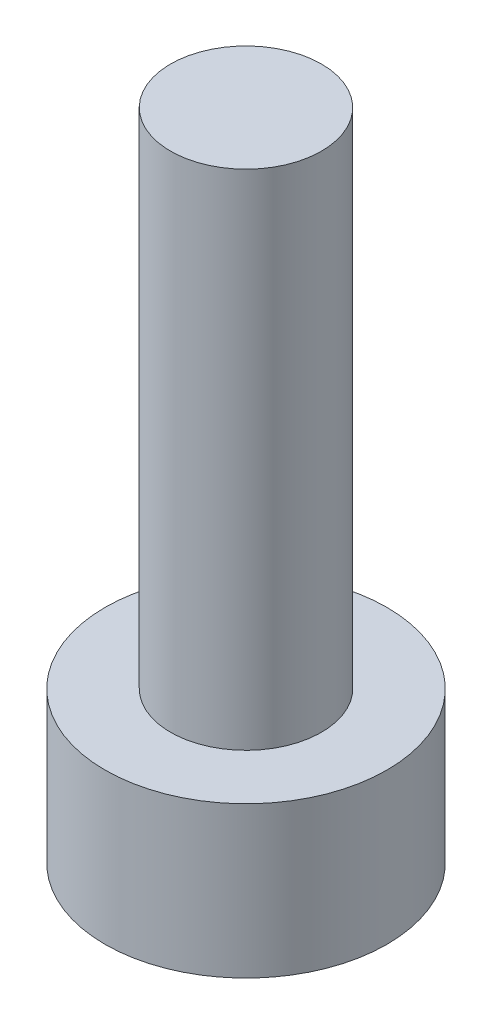
ISO-10303-21;
HEADER;
FILE_DESCRIPTION(('STEP AP214'),'2;1');
FILE_NAME('part.step','',(''),(''),'','','');
FILE_SCHEMA(('AUTOMOTIVE_DESIGN { 1 0 10303 214 1 1 1 1 }'));
ENDSEC;
DATA;
#1=APPLICATION_CONTEXT('core data for automotive mechanical design processes');
#2=APPLICATION_PROTOCOL_DEFINITION('international standard','automotive_design',2000,#1);
#3=PRODUCT_CONTEXT('',#1,'mechanical');
#4=PRODUCT('Part','Part','',(#3));
#5=PRODUCT_RELATED_PRODUCT_CATEGORY('part','',(#4));
#6=PRODUCT_DEFINITION_FORMATION('','',#4);
#7=PRODUCT_DEFINITION_CONTEXT('part definition',#1,'design');
#8=PRODUCT_DEFINITION('design','',#6,#7);
#9=PRODUCT_DEFINITION_SHAPE('','',#8);
#10=(LENGTH_UNIT() NAMED_UNIT(*) SI_UNIT(.MILLI.,.METRE.));
#11=(NAMED_UNIT(*) PLANE_ANGLE_UNIT() SI_UNIT($,.RADIAN.));
#12=(NAMED_UNIT(*) SI_UNIT($,.STERADIAN.) SOLID_ANGLE_UNIT());
#13=UNCERTAINTY_MEASURE_WITH_UNIT(LENGTH_MEASURE(1.E-05),#10,'distance_accuracy_value','');
#14=(GEOMETRIC_REPRESENTATION_CONTEXT(3) GLOBAL_UNCERTAINTY_ASSIGNED_CONTEXT((#13)) GLOBAL_UNIT_ASSIGNED_CONTEXT((#10,
#11,#12)) REPRESENTATION_CONTEXT('',''));
#15=CARTESIAN_POINT('',(0.,0.,0.));
#16=DIRECTION('',(0.,0.,1.));
#17=DIRECTION('',(1.,0.,0.));
#18=AXIS2_PLACEMENT_3D('',#15,#16,#17);
#19=CARTESIAN_POINT('',(0.,0.5,0.));
#20=DIRECTION('',(0.,-1.,0.));
#21=DIRECTION('',(0.,0.,-1.));
#22=AXIS2_PLACEMENT_3D('',#19,#20,#21);
#23=PLANE('',#22);
#24=DIRECTION('',(-0.5,0.,0.866025403784439));
#25=VECTOR('',#24,1.);
#26=CARTESIAN_POINT('',(-1.44337567297406,0.5,0.));
#27=LINE('',#26,#25);
#28=CARTESIAN_POINT('',(-1.44337567297406,0.5,0.));
#29=VERTEX_POINT('',#28);
#30=CARTESIAN_POINT('',(-0.721687836487032,0.5,-1.25));
#31=VERTEX_POINT('',#30);
#32=EDGE_CURVE('E90',#29,#31,#27,.F.);
#33=ORIENTED_EDGE('',*,*,#32,.T.);
#34=DIRECTION('',(-1.,0.,0.));
#35=VECTOR('',#34,1.);
#36=CARTESIAN_POINT('',(-0.721687836487032,0.5,-1.25));
#37=LINE('',#36,#35);
#38=CARTESIAN_POINT('',(0.721687836487032,0.5,-1.25));
#39=VERTEX_POINT('',#38);
#40=EDGE_CURVE('E126',#31,#39,#37,.F.);
#41=ORIENTED_EDGE('',*,*,#40,.T.);
#42=DIRECTION('',(-0.5,0.,-0.866025403784439));
#43=VECTOR('',#42,1.);
#44=CARTESIAN_POINT('',(0.721687836487032,0.5,-1.25));
#45=LINE('',#44,#43);
#46=CARTESIAN_POINT('',(1.44337567297406,0.5,0.));
#47=VERTEX_POINT('',#46);
#48=EDGE_CURVE('E121',#39,#47,#45,.F.);
#49=ORIENTED_EDGE('',*,*,#48,.T.);
#50=DIRECTION('',(0.5,0.,-0.866025403784438));
#51=VECTOR('',#50,1.);
#52=CARTESIAN_POINT('',(1.44337567297406,0.5,0.));
#53=LINE('',#52,#51);
#54=CARTESIAN_POINT('',(0.721687836487032,0.5,1.25));
#55=VERTEX_POINT('',#54);
#56=EDGE_CURVE('E73',#47,#55,#53,.F.);
#57=ORIENTED_EDGE('',*,*,#56,.T.);
#58=DIRECTION('',(1.,0.,0.));
#59=VECTOR('',#58,1.);
#60=CARTESIAN_POINT('',(0.721687836487032,0.5,1.25));
#61=LINE('',#60,#59);
#62=CARTESIAN_POINT('',(-0.721687836487032,0.5,1.25));
#63=VERTEX_POINT('',#62);
#64=EDGE_CURVE('E70',#55,#63,#61,.F.);
#65=ORIENTED_EDGE('',*,*,#64,.T.);
#66=DIRECTION('',(0.5,0.,0.866025403784439));
#67=VECTOR('',#66,1.);
#68=CARTESIAN_POINT('',(-0.721687836487032,0.5,1.25));
#69=LINE('',#68,#67);
#70=EDGE_CURVE('E67',#63,#29,#69,.F.);
#71=ORIENTED_EDGE('',*,*,#70,.T.);
#72=EDGE_LOOP('',(#33,#41,#49,#57,#65,#71));
#73=FACE_BOUND('',#72,.T.);
#74=ADVANCED_FACE('F16',(#73),#23,.T.);
#75=CARTESIAN_POINT('',(0.721687836487032,0.5,1.25));
#76=DIRECTION('',(0.,0.,1.));
#77=DIRECTION('',(1.,0.,0.));
#78=AXIS2_PLACEMENT_3D('',#75,#76,#77);
#79=PLANE('',#78);
#80=DIRECTION('',(0.,1.,0.));
#81=VECTOR('',#80,1.);
#82=CARTESIAN_POINT('',(-0.721687836487032,0.5,1.25));
#83=LINE('',#82,#81);
#84=CARTESIAN_POINT('',(-0.721687836487032,0.,1.25));
#85=VERTEX_POINT('',#84);
#86=EDGE_CURVE('E76',#85,#63,#83,.T.);
#87=ORIENTED_EDGE('',*,*,#86,.T.);
#88=ORIENTED_EDGE('',*,*,#64,.F.);
#89=DIRECTION('',(0.,1.,0.));
#90=VECTOR('',#89,1.);
#91=CARTESIAN_POINT('',(0.721687836487032,0.5,1.25));
#92=LINE('',#91,#90);
#93=CARTESIAN_POINT('',(0.721687836487032,0.,1.25));
#94=VERTEX_POINT('',#93);
#95=EDGE_CURVE('E116',#55,#94,#92,.F.);
#96=ORIENTED_EDGE('',*,*,#95,.T.);
#97=DIRECTION('',(1.,0.,0.));
#98=VECTOR('',#97,1.);
#99=CARTESIAN_POINT('',(0.,0.,1.25));
#100=LINE('',#99,#98);
#101=EDGE_CURVE('E81',#94,#85,#100,.F.);
#102=ORIENTED_EDGE('',*,*,#101,.T.);
#103=EDGE_LOOP('',(#87,#88,#96,#102));
#104=FACE_BOUND('',#103,.T.);
#105=ADVANCED_FACE('F79',(#104),#79,.F.);
#106=CARTESIAN_POINT('',(-0.721687836487032,0.5,1.25));
#107=DIRECTION('',(-0.866025403784439,0.,0.5));
#108=DIRECTION('',(0.5,0.,0.866025403784439));
#109=AXIS2_PLACEMENT_3D('',#106,#107,#108);
#110=PLANE('',#109);
#111=DIRECTION('',(0.,1.,0.));
#112=VECTOR('',#111,1.);
#113=CARTESIAN_POINT('',(-1.44337567297406,0.5,0.));
#114=LINE('',#113,#112);
#115=CARTESIAN_POINT('',(-1.44337567297406,0.,0.));
#116=VERTEX_POINT('',#115);
#117=EDGE_CURVE('E87',#116,#29,#114,.T.);
#118=ORIENTED_EDGE('',*,*,#117,.T.);
#119=ORIENTED_EDGE('',*,*,#70,.F.);
#120=ORIENTED_EDGE('',*,*,#86,.F.);
#121=DIRECTION('',(-0.5,0.,-0.866025403784439));
#122=VECTOR('',#121,1.);
#123=CARTESIAN_POINT('',(-0.721687836487032,0.,1.25));
#124=LINE('',#123,#122);
#125=EDGE_CURVE('E113',#85,#116,#124,.T.);
#126=ORIENTED_EDGE('',*,*,#125,.T.);
#127=EDGE_LOOP('',(#118,#119,#120,#126));
#128=FACE_BOUND('',#127,.T.);
#129=ADVANCED_FACE('F85',(#128),#110,.F.);
#130=CARTESIAN_POINT('',(-1.44337567297406,0.5,0.));
#131=DIRECTION('',(-0.866025403784439,0.,-0.5));
#132=DIRECTION('',(-0.5,0.,0.866025403784439));
#133=AXIS2_PLACEMENT_3D('',#130,#131,#132);
#134=PLANE('',#133);
#135=DIRECTION('',(0.,1.,0.));
#136=VECTOR('',#135,1.);
#137=CARTESIAN_POINT('',(-0.721687836487032,0.5,-1.25));
#138=LINE('',#137,#136);
#139=CARTESIAN_POINT('',(-0.721687836487031,0.,-1.25));
#140=VERTEX_POINT('',#139);
#141=EDGE_CURVE('E128',#140,#31,#138,.T.);
#142=ORIENTED_EDGE('',*,*,#141,.T.);
#143=ORIENTED_EDGE('',*,*,#32,.F.);
#144=ORIENTED_EDGE('',*,*,#117,.F.);
#145=DIRECTION('',(0.5,0.,-0.866025403784438));
#146=VECTOR('',#145,1.);
#147=CARTESIAN_POINT('',(-1.44337567297406,0.,0.));
#148=LINE('',#147,#146);
#149=EDGE_CURVE('E111',#116,#140,#148,.T.);
#150=ORIENTED_EDGE('',*,*,#149,.T.);
#151=EDGE_LOOP('',(#142,#143,#144,#150));
#152=FACE_BOUND('',#151,.T.);
#153=ADVANCED_FACE('F133',(#152),#134,.F.);
#154=CARTESIAN_POINT('',(-0.721687836487032,0.5,-1.25));
#155=DIRECTION('',(0.,0.,-1.));
#156=DIRECTION('',(-1.,0.,0.));
#157=AXIS2_PLACEMENT_3D('',#154,#155,#156);
#158=PLANE('',#157);
#159=DIRECTION('',(0.,1.,0.));
#160=VECTOR('',#159,1.);
#161=CARTESIAN_POINT('',(0.721687836487032,0.5,-1.25));
#162=LINE('',#161,#160);
#163=CARTESIAN_POINT('',(0.721687836487032,0.,-1.25));
#164=VERTEX_POINT('',#163);
#165=EDGE_CURVE('E123',#164,#39,#162,.T.);
#166=ORIENTED_EDGE('',*,*,#165,.T.);
#167=ORIENTED_EDGE('',*,*,#40,.F.);
#168=ORIENTED_EDGE('',*,*,#141,.F.);
#169=DIRECTION('',(1.,0.,0.));
#170=VECTOR('',#169,1.);
#171=CARTESIAN_POINT('',(0.,0.,-1.25));
#172=LINE('',#171,#170);
#173=EDGE_CURVE('E107',#140,#164,#172,.T.);
#174=ORIENTED_EDGE('',*,*,#173,.T.);
#175=EDGE_LOOP('',(#166,#167,#168,#174));
#176=FACE_BOUND('',#175,.T.);
#177=ADVANCED_FACE('F137',(#176),#158,.F.);
#178=CARTESIAN_POINT('',(0.721687836487032,0.5,-1.25));
#179=DIRECTION('',(0.866025403784439,0.,-0.5));
#180=DIRECTION('',(-0.5,0.,-0.866025403784439));
#181=AXIS2_PLACEMENT_3D('',#178,#179,#180);
#182=PLANE('',#181);
#183=DIRECTION('',(0.,1.,0.));
#184=VECTOR('',#183,1.);
#185=CARTESIAN_POINT('',(1.44337567297406,0.5,0.));
#186=LINE('',#185,#184);
#187=CARTESIAN_POINT('',(1.44337567297406,0.,0.));
#188=VERTEX_POINT('',#187);
#189=EDGE_CURVE('E119',#188,#47,#186,.T.);
#190=ORIENTED_EDGE('',*,*,#189,.T.);
#191=ORIENTED_EDGE('',*,*,#48,.F.);
#192=ORIENTED_EDGE('',*,*,#165,.F.);
#193=DIRECTION('',(0.5,0.,0.866025403784438));
#194=VECTOR('',#193,1.);
#195=CARTESIAN_POINT('',(0.721687836487032,0.,-1.25));
#196=LINE('',#195,#194);
#197=EDGE_CURVE('E34',#164,#188,#196,.T.);
#198=ORIENTED_EDGE('',*,*,#197,.T.);
#199=EDGE_LOOP('',(#190,#191,#192,#198));
#200=FACE_BOUND('',#199,.T.);
#201=ADVANCED_FACE('F139',(#200),#182,.F.);
#202=CARTESIAN_POINT('',(1.44337567297406,0.5,0.));
#203=DIRECTION('',(0.866025403784438,0.,0.5));
#204=DIRECTION('',(0.5,0.,-0.866025403784438));
#205=AXIS2_PLACEMENT_3D('',#202,#203,#204);
#206=PLANE('',#205);
#207=ORIENTED_EDGE('',*,*,#95,.F.);
#208=ORIENTED_EDGE('',*,*,#56,.F.);
#209=ORIENTED_EDGE('',*,*,#189,.F.);
#210=DIRECTION('',(-0.500000000000001,0.,0.866025403784438));
#211=VECTOR('',#210,1.);
#212=CARTESIAN_POINT('',(1.44337567297406,0.,0.));
#213=LINE('',#212,#211);
#214=EDGE_CURVE('E100',#188,#94,#213,.T.);
#215=ORIENTED_EDGE('',*,*,#214,.T.);
#216=EDGE_LOOP('',(#207,#208,#209,#215));
#217=FACE_BOUND('',#216,.T.);
#218=ADVANCED_FACE('F140',(#217),#206,.F.);
#219=CARTESIAN_POINT('',(0.,0.,0.));
#220=DIRECTION('',(0.,1.,0.));
#221=DIRECTION('',(0.,0.,1.));
#222=AXIS2_PLACEMENT_3D('',#219,#220,#221);
#223=PLANE('',#222);
#224=CARTESIAN_POINT('',(0.,0.,0.));
#225=DIRECTION('',(0.,-1.,0.));
#226=DIRECTION('',(0.,0.,-1.));
#227=AXIS2_PLACEMENT_3D('',#224,#225,#226);
#228=CIRCLE('',#227,2.8);
#229=CARTESIAN_POINT('',(0.,0.,-2.8));
#230=VERTEX_POINT('',#229);
#231=EDGE_CURVE('E19',#230,#230,#228,.F.);
#232=ORIENTED_EDGE('',*,*,#231,.F.);
#233=EDGE_LOOP('',(#232));
#234=FACE_BOUND('',#233,.T.);
#235=ORIENTED_EDGE('',*,*,#197,.F.);
#236=ORIENTED_EDGE('',*,*,#173,.F.);
#237=ORIENTED_EDGE('',*,*,#149,.F.);
#238=ORIENTED_EDGE('',*,*,#125,.F.);
#239=ORIENTED_EDGE('',*,*,#101,.F.);
#240=ORIENTED_EDGE('',*,*,#214,.F.);
#241=EDGE_LOOP('',(#235,#236,#237,#238,#239,#240));
#242=FACE_BOUND('',#241,.T.);
#243=ADVANCED_FACE('F142',(#234,#242),#223,.F.);
#244=CARTESIAN_POINT('',(0.,3.,0.));
#245=DIRECTION('',(0.,-1.,0.));
#246=DIRECTION('',(0.,0.,-1.));
#247=AXIS2_PLACEMENT_3D('',#244,#245,#246);
#248=CYLINDRICAL_SURFACE('',#247,2.8);
#249=ORIENTED_EDGE('',*,*,#231,.T.);
#250=EDGE_LOOP('',(#249));
#251=FACE_BOUND('',#250,.T.);
#252=CARTESIAN_POINT('',(0.,3.,0.));
#253=DIRECTION('',(0.,-1.,0.));
#254=DIRECTION('',(0.,0.,-1.));
#255=AXIS2_PLACEMENT_3D('',#252,#253,#254);
#256=CIRCLE('',#255,2.8);
#257=CARTESIAN_POINT('',(0.,3.,-2.8));
#258=VERTEX_POINT('',#257);
#259=EDGE_CURVE('E95',#258,#258,#256,.F.);
#260=ORIENTED_EDGE('',*,*,#259,.F.);
#261=EDGE_LOOP('',(#260));
#262=FACE_BOUND('',#261,.T.);
#263=ADVANCED_FACE('F149',(#251,#262),#248,.T.);
#264=CARTESIAN_POINT('',(0.,13.,0.));
#265=DIRECTION('',(0.,1.,0.));
#266=DIRECTION('',(0.,0.,1.));
#267=AXIS2_PLACEMENT_3D('',#264,#265,#266);
#268=PLANE('',#267);
#269=CARTESIAN_POINT('',(0.,13.,0.));
#270=DIRECTION('',(0.,-1.,0.));
#271=DIRECTION('',(0.,0.,-1.));
#272=AXIS2_PLACEMENT_3D('',#269,#270,#271);
#273=CIRCLE('',#272,1.5);
#274=CARTESIAN_POINT('',(0.,13.,-1.5));
#275=VERTEX_POINT('',#274);
#276=EDGE_CURVE('E25',#275,#275,#273,.T.);
#277=ORIENTED_EDGE('',*,*,#276,.F.);
#278=EDGE_LOOP('',(#277));
#279=FACE_BOUND('',#278,.T.);
#280=ADVANCED_FACE('F161',(#279),#268,.T.);
#281=CARTESIAN_POINT('',(0.,3.,0.));
#282=DIRECTION('',(0.,1.,0.));
#283=DIRECTION('',(0.,0.,1.));
#284=AXIS2_PLACEMENT_3D('',#281,#282,#283);
#285=PLANE('',#284);
#286=CARTESIAN_POINT('',(0.,3.,0.));
#287=DIRECTION('',(0.,-1.,0.));
#288=DIRECTION('',(0.,0.,-1.));
#289=AXIS2_PLACEMENT_3D('',#286,#287,#288);
#290=CIRCLE('',#289,1.5);
#291=CARTESIAN_POINT('',(0.,3.,-1.5));
#292=VERTEX_POINT('',#291);
#293=EDGE_CURVE('E11',#292,#292,#290,.F.);
#294=ORIENTED_EDGE('',*,*,#293,.F.);
#295=EDGE_LOOP('',(#294));
#296=FACE_BOUND('',#295,.T.);
#297=ORIENTED_EDGE('',*,*,#259,.T.);
#298=EDGE_LOOP('',(#297));
#299=FACE_BOUND('',#298,.T.);
#300=ADVANCED_FACE('F155',(#296,#299),#285,.T.);
#301=CARTESIAN_POINT('',(0.,13.,0.));
#302=DIRECTION('',(0.,-1.,0.));
#303=DIRECTION('',(0.,0.,-1.));
#304=AXIS2_PLACEMENT_3D('',#301,#302,#303);
#305=CYLINDRICAL_SURFACE('',#304,1.5);
#306=ORIENTED_EDGE('',*,*,#293,.T.);
#307=EDGE_LOOP('',(#306));
#308=FACE_BOUND('',#307,.T.);
#309=ORIENTED_EDGE('',*,*,#276,.T.);
#310=EDGE_LOOP('',(#309));
#311=FACE_BOUND('',#310,.T.);
#312=ADVANCED_FACE('F153',(#308,#311),#305,.T.);
#313=CLOSED_SHELL('',(#74,#105,#129,#153,#177,#201,#218,#243,#263,#280,#300,#312));
#314=MANIFOLD_SOLID_BREP('B1',#313);
#315=ADVANCED_BREP_SHAPE_REPRESENTATION('',(#18,#314),#14);
#316=SHAPE_DEFINITION_REPRESENTATION(#9,#315);
ENDSEC;
END-ISO-10303-21;
